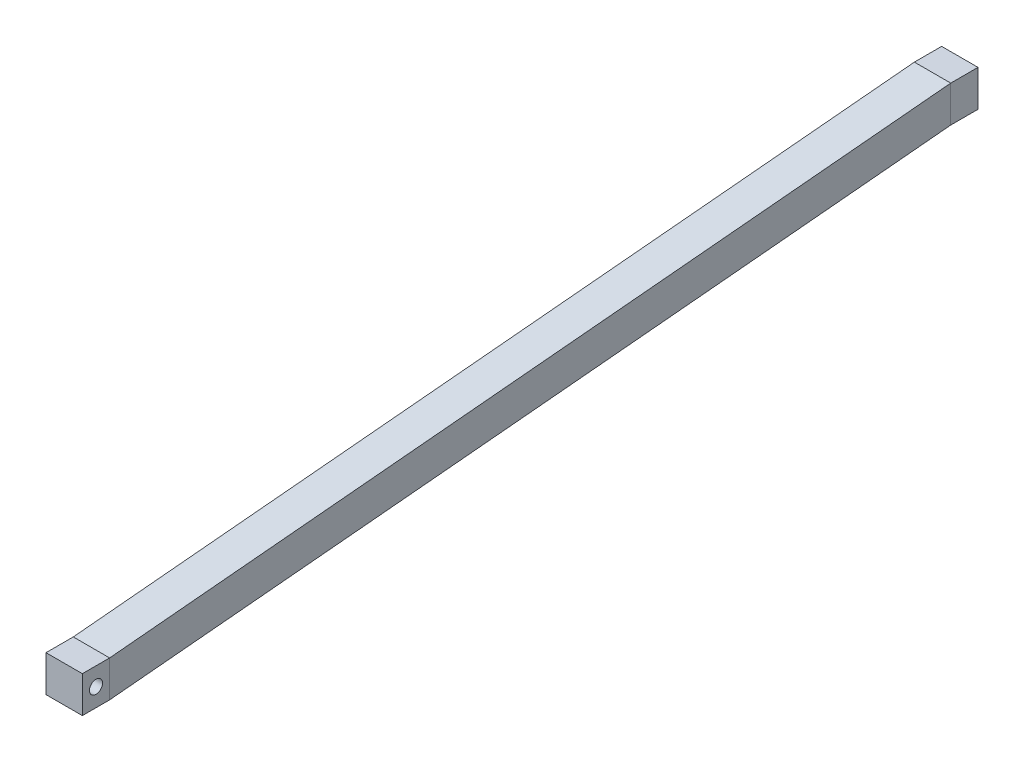
ISO-10303-21;
HEADER;
FILE_DESCRIPTION(('STEP AP214'),'2;1');
FILE_NAME('part.step','',(''),(''),'','','');
FILE_SCHEMA(('AUTOMOTIVE_DESIGN { 1 0 10303 214 1 1 1 1 }'));
ENDSEC;
DATA;
#1=APPLICATION_CONTEXT('core data for automotive mechanical design processes');
#2=APPLICATION_PROTOCOL_DEFINITION('international standard','automotive_design',2000,#1);
#3=PRODUCT_CONTEXT('',#1,'mechanical');
#4=PRODUCT('Part','Part','',(#3));
#5=PRODUCT_RELATED_PRODUCT_CATEGORY('part','',(#4));
#6=PRODUCT_DEFINITION_FORMATION('','',#4);
#7=PRODUCT_DEFINITION_CONTEXT('part definition',#1,'design');
#8=PRODUCT_DEFINITION('design','',#6,#7);
#9=PRODUCT_DEFINITION_SHAPE('','',#8);
#10=(LENGTH_UNIT() NAMED_UNIT(*) SI_UNIT(.MILLI.,.METRE.));
#11=(NAMED_UNIT(*) PLANE_ANGLE_UNIT() SI_UNIT($,.RADIAN.));
#12=(NAMED_UNIT(*) SI_UNIT($,.STERADIAN.) SOLID_ANGLE_UNIT());
#13=UNCERTAINTY_MEASURE_WITH_UNIT(LENGTH_MEASURE(1.E-05),#10,'distance_accuracy_value','');
#14=(GEOMETRIC_REPRESENTATION_CONTEXT(3) GLOBAL_UNCERTAINTY_ASSIGNED_CONTEXT((#13)) GLOBAL_UNIT_ASSIGNED_CONTEXT((#10,
#11,#12)) REPRESENTATION_CONTEXT('',''));
#15=CARTESIAN_POINT('',(0.,0.,0.));
#16=DIRECTION('',(0.,0.,1.));
#17=DIRECTION('',(1.,0.,0.));
#18=AXIS2_PLACEMENT_3D('',#15,#16,#17);
#19=CARTESIAN_POINT('',(0.,-5.66935990611303,-1.96438124069023));
#20=DIRECTION('',(0.,0.944887603707366,0.327394893607323));
#21=DIRECTION('',(0.,-0.327394893607323,0.944887603707367));
#22=AXIS2_PLACEMENT_3D('',#19,#20,#21);
#23=PLANE('',#22);
#24=DIRECTION('',(-0.215198919121659,-0.319724108409322,0.92274910984012));
#25=VECTOR('',#24,1.);
#26=CARTESIAN_POINT('',(6.35,-6.35,0.));
#27=LINE('',#26,#25);
#28=CARTESIAN_POINT('',(6.35,-6.35,0.));
#29=VERTEX_POINT('',#28);
#30=CARTESIAN_POINT('',(-49.2125,-88.9,238.245840754));
#31=VERTEX_POINT('',#30);
#32=EDGE_CURVE('E208',#29,#31,#27,.T.);
#33=ORIENTED_EDGE('',*,*,#32,.T.);
#34=DIRECTION('',(1.,0.,0.));
#35=VECTOR('',#34,1.);
#36=CARTESIAN_POINT('',(-49.2125,-88.9,238.245840754));
#37=LINE('',#36,#35);
#38=CARTESIAN_POINT('',(-61.9125,-88.9,238.245840754));
#39=VERTEX_POINT('',#38);
#40=EDGE_CURVE('E12',#39,#31,#37,.T.);
#41=ORIENTED_EDGE('',*,*,#40,.F.);
#42=DIRECTION('',(-0.215198919121659,-0.319724108409322,0.92274910984012));
#43=VECTOR('',#42,1.);
#44=CARTESIAN_POINT('',(-6.35,-6.35,0.));
#45=LINE('',#44,#43);
#46=CARTESIAN_POINT('',(-6.35,-6.35,0.));
#47=VERTEX_POINT('',#46);
#48=EDGE_CURVE('E70',#47,#39,#45,.T.);
#49=ORIENTED_EDGE('',*,*,#48,.F.);
#50=DIRECTION('',(1.,0.,0.));
#51=VECTOR('',#50,1.);
#52=CARTESIAN_POINT('',(-6.35,-6.35,0.));
#53=LINE('',#52,#51);
#54=EDGE_CURVE('E226',#47,#29,#53,.T.);
#55=ORIENTED_EDGE('',*,*,#54,.T.);
#56=EDGE_LOOP('',(#33,#41,#49,#55));
#57=FACE_BOUND('',#56,.T.);
#58=ADVANCED_FACE('F51',(#57),#23,.F.);
#59=CARTESIAN_POINT('',(-6.02244391925538,0.,-1.4045241637991));
#60=DIRECTION('',(0.973866708146997,0.,0.227120309005894));
#61=DIRECTION('',(0.227120309005894,0.,-0.973866708146997));
#62=AXIS2_PLACEMENT_3D('',#59,#60,#61);
#63=PLANE('',#62);
#64=ORIENTED_EDGE('',*,*,#48,.T.);
#65=DIRECTION('',(0.,-1.,0.));
#66=VECTOR('',#65,1.);
#67=CARTESIAN_POINT('',(-61.9125,-88.9,238.245840754));
#68=LINE('',#67,#66);
#69=CARTESIAN_POINT('',(-61.9125,-76.2,238.245840754));
#70=VERTEX_POINT('',#69);
#71=EDGE_CURVE('E56',#70,#39,#68,.T.);
#72=ORIENTED_EDGE('',*,*,#71,.F.);
#73=DIRECTION('',(-0.215198919121659,-0.319724108409322,0.92274910984012));
#74=VECTOR('',#73,1.);
#75=CARTESIAN_POINT('',(-6.35,6.35,0.));
#76=LINE('',#75,#74);
#77=CARTESIAN_POINT('',(-6.35,6.35,0.));
#78=VERTEX_POINT('',#77);
#79=EDGE_CURVE('E301',#78,#70,#76,.T.);
#80=ORIENTED_EDGE('',*,*,#79,.F.);
#81=DIRECTION('',(0.,-1.,0.));
#82=VECTOR('',#81,1.);
#83=CARTESIAN_POINT('',(-6.35,6.35,0.));
#84=LINE('',#83,#82);
#85=EDGE_CURVE('E209',#78,#47,#84,.T.);
#86=ORIENTED_EDGE('',*,*,#85,.T.);
#87=EDGE_LOOP('',(#64,#72,#80,#86));
#88=FACE_BOUND('',#87,.T.);
#89=ADVANCED_FACE('F302',(#88),#63,.F.);
#90=CARTESIAN_POINT('',(6.02244391925536,0.,1.4045241637991));
#91=DIRECTION('',(-0.973866708146996,0.,-0.227120309005894));
#92=DIRECTION('',(-0.227120309005894,0.,0.973866708146997));
#93=AXIS2_PLACEMENT_3D('',#90,#91,#92);
#94=PLANE('',#93);
#95=DIRECTION('',(-0.215198919121659,-0.319724108409322,0.92274910984012));
#96=VECTOR('',#95,1.);
#97=CARTESIAN_POINT('',(6.35,6.35,0.));
#98=LINE('',#97,#96);
#99=CARTESIAN_POINT('',(6.35,6.35,0.));
#100=VERTEX_POINT('',#99);
#101=CARTESIAN_POINT('',(-49.2125,-76.2,238.245840754));
#102=VERTEX_POINT('',#101);
#103=EDGE_CURVE('E304',#100,#102,#98,.T.);
#104=ORIENTED_EDGE('',*,*,#103,.T.);
#105=DIRECTION('',(0.,1.,0.));
#106=VECTOR('',#105,1.);
#107=CARTESIAN_POINT('',(-49.2125,-88.9,238.245840754));
#108=LINE('',#107,#106);
#109=EDGE_CURVE('E62',#31,#102,#108,.T.);
#110=ORIENTED_EDGE('',*,*,#109,.F.);
#111=ORIENTED_EDGE('',*,*,#32,.F.);
#112=DIRECTION('',(0.,1.,0.));
#113=VECTOR('',#112,1.);
#114=CARTESIAN_POINT('',(6.35,6.35,0.));
#115=LINE('',#114,#113);
#116=EDGE_CURVE('E287',#29,#100,#115,.T.);
#117=ORIENTED_EDGE('',*,*,#116,.T.);
#118=EDGE_LOOP('',(#104,#110,#111,#117));
#119=FACE_BOUND('',#118,.T.);
#120=ADVANCED_FACE('F337',(#119),#94,.F.);
#121=CARTESIAN_POINT('',(0.,5.66935990611307,1.96438124069025));
#122=DIRECTION('',(0.,-0.944887603707367,-0.327394893607323));
#123=DIRECTION('',(0.,0.327394893607323,-0.944887603707367));
#124=AXIS2_PLACEMENT_3D('',#121,#122,#123);
#125=PLANE('',#124);
#126=ORIENTED_EDGE('',*,*,#79,.T.);
#127=DIRECTION('',(-1.,0.,0.));
#128=VECTOR('',#127,1.);
#129=CARTESIAN_POINT('',(-49.2125,-76.2,238.245840754));
#130=LINE('',#129,#128);
#131=EDGE_CURVE('E238',#102,#70,#130,.T.);
#132=ORIENTED_EDGE('',*,*,#131,.F.);
#133=ORIENTED_EDGE('',*,*,#103,.F.);
#134=DIRECTION('',(-1.,0.,0.));
#135=VECTOR('',#134,1.);
#136=CARTESIAN_POINT('',(-6.35,6.35,0.));
#137=LINE('',#136,#135);
#138=EDGE_CURVE('E204',#100,#78,#137,.T.);
#139=ORIENTED_EDGE('',*,*,#138,.T.);
#140=EDGE_LOOP('',(#126,#132,#133,#139));
#141=FACE_BOUND('',#140,.T.);
#142=ADVANCED_FACE('F53',(#141),#125,.F.);
#143=CARTESIAN_POINT('',(6.35,6.35,-9.525));
#144=DIRECTION('',(-1.,0.,0.));
#145=DIRECTION('',(0.,0.,1.));
#146=AXIS2_PLACEMENT_3D('',#143,#144,#145);
#147=PLANE('',#146);
#148=ORIENTED_EDGE('',*,*,#116,.F.);
#149=DIRECTION('',(0.,0.,1.));
#150=VECTOR('',#149,1.);
#151=CARTESIAN_POINT('',(6.35,-6.35,-9.525));
#152=LINE('',#151,#150);
#153=CARTESIAN_POINT('',(6.35,-6.35,-9.525));
#154=VERTEX_POINT('',#153);
#155=EDGE_CURVE('E282',#154,#29,#152,.T.);
#156=ORIENTED_EDGE('',*,*,#155,.F.);
#157=DIRECTION('',(0.,-1.,0.));
#158=VECTOR('',#157,1.);
#159=CARTESIAN_POINT('',(6.35,6.35,-9.525));
#160=LINE('',#159,#158);
#161=CARTESIAN_POINT('',(6.35,6.35,-9.525));
#162=VERTEX_POINT('',#161);
#163=EDGE_CURVE('E148',#162,#154,#160,.T.);
#164=ORIENTED_EDGE('',*,*,#163,.F.);
#165=DIRECTION('',(0.,0.,1.));
#166=VECTOR('',#165,1.);
#167=CARTESIAN_POINT('',(6.35,6.35,-9.525));
#168=LINE('',#167,#166);
#169=EDGE_CURVE('E192',#162,#100,#168,.T.);
#170=ORIENTED_EDGE('',*,*,#169,.T.);
#171=EDGE_LOOP('',(#148,#156,#164,#170));
#172=FACE_BOUND('',#171,.T.);
#173=ADVANCED_FACE('F379',(#172),#147,.F.);
#174=CARTESIAN_POINT('',(6.35,-6.35,-9.525));
#175=DIRECTION('',(0.,1.,0.));
#176=DIRECTION('',(0.,0.,1.));
#177=AXIS2_PLACEMENT_3D('',#174,#175,#176);
#178=PLANE('',#177);
#179=ORIENTED_EDGE('',*,*,#54,.F.);
#180=DIRECTION('',(0.,0.,1.));
#181=VECTOR('',#180,1.);
#182=CARTESIAN_POINT('',(-6.35,-6.35,-9.525));
#183=LINE('',#182,#181);
#184=CARTESIAN_POINT('',(-6.35,-6.35,-9.525));
#185=VERTEX_POINT('',#184);
#186=EDGE_CURVE('E276',#185,#47,#183,.T.);
#187=ORIENTED_EDGE('',*,*,#186,.F.);
#188=DIRECTION('',(-1.,0.,0.));
#189=VECTOR('',#188,1.);
#190=CARTESIAN_POINT('',(6.35,-6.35,-9.525));
#191=LINE('',#190,#189);
#192=EDGE_CURVE('E151',#154,#185,#191,.T.);
#193=ORIENTED_EDGE('',*,*,#192,.F.);
#194=ORIENTED_EDGE('',*,*,#155,.T.);
#195=EDGE_LOOP('',(#179,#187,#193,#194));
#196=FACE_BOUND('',#195,.T.);
#197=ADVANCED_FACE('F381',(#196),#178,.F.);
#198=CARTESIAN_POINT('',(-6.35,6.35,-9.525));
#199=DIRECTION('',(1.,0.,0.));
#200=DIRECTION('',(0.,0.,-1.));
#201=AXIS2_PLACEMENT_3D('',#198,#199,#200);
#202=PLANE('',#201);
#203=ORIENTED_EDGE('',*,*,#85,.F.);
#204=DIRECTION('',(0.,0.,1.));
#205=VECTOR('',#204,1.);
#206=CARTESIAN_POINT('',(-6.35,6.35,-9.525));
#207=LINE('',#206,#205);
#208=CARTESIAN_POINT('',(-6.35,6.35,-9.525));
#209=VERTEX_POINT('',#208);
#210=EDGE_CURVE('E200',#209,#78,#207,.T.);
#211=ORIENTED_EDGE('',*,*,#210,.F.);
#212=DIRECTION('',(0.,1.,0.));
#213=VECTOR('',#212,1.);
#214=CARTESIAN_POINT('',(-6.35,6.35,-9.525));
#215=LINE('',#214,#213);
#216=EDGE_CURVE('E374',#185,#209,#215,.T.);
#217=ORIENTED_EDGE('',*,*,#216,.F.);
#218=ORIENTED_EDGE('',*,*,#186,.T.);
#219=EDGE_LOOP('',(#203,#211,#217,#218));
#220=FACE_BOUND('',#219,.T.);
#221=ADVANCED_FACE('F182',(#220),#202,.F.);
#222=CARTESIAN_POINT('',(6.35,6.35,-9.525));
#223=DIRECTION('',(0.,-1.,0.));
#224=DIRECTION('',(0.,0.,-1.));
#225=AXIS2_PLACEMENT_3D('',#222,#223,#224);
#226=PLANE('',#225);
#227=ORIENTED_EDGE('',*,*,#138,.F.);
#228=ORIENTED_EDGE('',*,*,#169,.F.);
#229=DIRECTION('',(1.,0.,0.));
#230=VECTOR('',#229,1.);
#231=CARTESIAN_POINT('',(6.35,6.35,-9.525));
#232=LINE('',#231,#230);
#233=EDGE_CURVE('E201',#209,#162,#232,.T.);
#234=ORIENTED_EDGE('',*,*,#233,.F.);
#235=ORIENTED_EDGE('',*,*,#210,.T.);
#236=EDGE_LOOP('',(#227,#228,#234,#235));
#237=FACE_BOUND('',#236,.T.);
#238=ADVANCED_FACE('F177',(#237),#226,.F.);
#239=CARTESIAN_POINT('',(0.,0.,-9.525));
#240=DIRECTION('',(0.,0.,-1.));
#241=DIRECTION('',(-1.,0.,0.));
#242=AXIS2_PLACEMENT_3D('',#239,#240,#241);
#243=PLANE('',#242);
#244=CARTESIAN_POINT('',(0.,0.,-9.525));
#245=DIRECTION('',(0.,0.,-1.));
#246=DIRECTION('',(-1.,0.,0.));
#247=AXIS2_PLACEMENT_3D('',#244,#245,#246);
#248=CIRCLE('',#247,1.905);
#249=CARTESIAN_POINT('',(-1.905,0.,-9.525));
#250=VERTEX_POINT('',#249);
#251=EDGE_CURVE('E548',#250,#250,#248,.T.);
#252=ORIENTED_EDGE('',*,*,#251,.F.);
#253=EDGE_LOOP('',(#252));
#254=FACE_BOUND('',#253,.T.);
#255=ORIENTED_EDGE('',*,*,#163,.T.);
#256=ORIENTED_EDGE('',*,*,#192,.T.);
#257=ORIENTED_EDGE('',*,*,#216,.T.);
#258=ORIENTED_EDGE('',*,*,#233,.T.);
#259=EDGE_LOOP('',(#255,#256,#257,#258));
#260=FACE_BOUND('',#259,.T.);
#261=ADVANCED_FACE('F171',(#254,#260),#243,.T.);
#262=CARTESIAN_POINT('',(-61.9125,-76.2,247.770840754));
#263=DIRECTION('',(1.,0.,0.));
#264=DIRECTION('',(0.,0.,-1.));
#265=AXIS2_PLACEMENT_3D('',#262,#263,#264);
#266=PLANE('',#265);
#267=CARTESIAN_POINT('',(-61.9125,-82.55,243.008340754));
#268=DIRECTION('',(1.,0.,0.));
#269=DIRECTION('',(0.,0.,-1.));
#270=AXIS2_PLACEMENT_3D('',#267,#268,#269);
#271=CIRCLE('',#270,2.28600000000004);
#272=CARTESIAN_POINT('',(-61.9125,-82.55,240.722340754));
#273=VERTEX_POINT('',#272);
#274=EDGE_CURVE('E144',#273,#273,#271,.T.);
#275=ORIENTED_EDGE('',*,*,#274,.T.);
#276=EDGE_LOOP('',(#275));
#277=FACE_BOUND('',#276,.T.);
#278=ORIENTED_EDGE('',*,*,#71,.T.);
#279=DIRECTION('',(0.,0.,-1.));
#280=VECTOR('',#279,1.);
#281=CARTESIAN_POINT('',(-61.9125,-88.9,247.770840754));
#282=LINE('',#281,#280);
#283=CARTESIAN_POINT('',(-61.9125,-88.9,247.770840754));
#284=VERTEX_POINT('',#283);
#285=EDGE_CURVE('E128',#284,#39,#282,.T.);
#286=ORIENTED_EDGE('',*,*,#285,.F.);
#287=DIRECTION('',(0.,-1.,0.));
#288=VECTOR('',#287,1.);
#289=CARTESIAN_POINT('',(-61.9125,-76.2,247.770840754));
#290=LINE('',#289,#288);
#291=CARTESIAN_POINT('',(-61.9125,-76.2,247.770840754));
#292=VERTEX_POINT('',#291);
#293=EDGE_CURVE('E135',#292,#284,#290,.T.);
#294=ORIENTED_EDGE('',*,*,#293,.F.);
#295=DIRECTION('',(0.,0.,-1.));
#296=VECTOR('',#295,1.);
#297=CARTESIAN_POINT('',(-61.9125,-76.2,247.770840754));
#298=LINE('',#297,#296);
#299=EDGE_CURVE('E230',#292,#70,#298,.T.);
#300=ORIENTED_EDGE('',*,*,#299,.T.);
#301=EDGE_LOOP('',(#278,#286,#294,#300));
#302=FACE_BOUND('',#301,.T.);
#303=ADVANCED_FACE('F146',(#277,#302),#266,.F.);
#304=CARTESIAN_POINT('',(-61.9125,-88.9,247.770840754));
#305=DIRECTION('',(0.,1.,0.));
#306=DIRECTION('',(0.,0.,1.));
#307=AXIS2_PLACEMENT_3D('',#304,#305,#306);
#308=PLANE('',#307);
#309=ORIENTED_EDGE('',*,*,#40,.T.);
#310=DIRECTION('',(0.,0.,-1.));
#311=VECTOR('',#310,1.);
#312=CARTESIAN_POINT('',(-49.2125,-88.9,247.770840754));
#313=LINE('',#312,#311);
#314=CARTESIAN_POINT('',(-49.2125,-88.9,247.770840754));
#315=VERTEX_POINT('',#314);
#316=EDGE_CURVE('E131',#315,#31,#313,.T.);
#317=ORIENTED_EDGE('',*,*,#316,.F.);
#318=DIRECTION('',(1.,0.,0.));
#319=VECTOR('',#318,1.);
#320=CARTESIAN_POINT('',(-61.9125,-88.9,247.770840754));
#321=LINE('',#320,#319);
#322=EDGE_CURVE('E124',#284,#315,#321,.T.);
#323=ORIENTED_EDGE('',*,*,#322,.F.);
#324=ORIENTED_EDGE('',*,*,#285,.T.);
#325=EDGE_LOOP('',(#309,#317,#323,#324));
#326=FACE_BOUND('',#325,.T.);
#327=ADVANCED_FACE('F126',(#326),#308,.F.);
#328=CARTESIAN_POINT('',(-49.2125,-76.2,247.770840754));
#329=DIRECTION('',(-1.,0.,0.));
#330=DIRECTION('',(0.,-1.,0.));
#331=AXIS2_PLACEMENT_3D('',#328,#329,#330);
#332=PLANE('',#331);
#333=CARTESIAN_POINT('',(-49.2125,-82.55,243.008340754));
#334=DIRECTION('',(1.,0.,0.));
#335=DIRECTION('',(0.,1.,0.));
#336=AXIS2_PLACEMENT_3D('',#333,#334,#335);
#337=CIRCLE('',#336,2.28600000000004);
#338=CARTESIAN_POINT('',(-49.2125,-80.264,243.008340754));
#339=VERTEX_POINT('',#338);
#340=EDGE_CURVE('E547',#339,#339,#337,.T.);
#341=ORIENTED_EDGE('',*,*,#340,.F.);
#342=EDGE_LOOP('',(#341));
#343=FACE_BOUND('',#342,.T.);
#344=ORIENTED_EDGE('',*,*,#109,.T.);
#345=DIRECTION('',(0.,0.,-1.));
#346=VECTOR('',#345,1.);
#347=CARTESIAN_POINT('',(-49.2125,-76.2,247.770840754));
#348=LINE('',#347,#346);
#349=CARTESIAN_POINT('',(-49.2125,-76.2,247.770840754));
#350=VERTEX_POINT('',#349);
#351=EDGE_CURVE('E153',#350,#102,#348,.T.);
#352=ORIENTED_EDGE('',*,*,#351,.F.);
#353=DIRECTION('',(0.,1.,0.));
#354=VECTOR('',#353,1.);
#355=CARTESIAN_POINT('',(-49.2125,-76.2,247.770840754));
#356=LINE('',#355,#354);
#357=EDGE_CURVE('E134',#315,#350,#356,.T.);
#358=ORIENTED_EDGE('',*,*,#357,.F.);
#359=ORIENTED_EDGE('',*,*,#316,.T.);
#360=EDGE_LOOP('',(#344,#352,#358,#359));
#361=FACE_BOUND('',#360,.T.);
#362=ADVANCED_FACE('F254',(#343,#361),#332,.F.);
#363=CARTESIAN_POINT('',(-61.9125,-76.2,247.770840754));
#364=DIRECTION('',(0.,-1.,0.));
#365=DIRECTION('',(0.,0.,-1.));
#366=AXIS2_PLACEMENT_3D('',#363,#364,#365);
#367=PLANE('',#366);
#368=ORIENTED_EDGE('',*,*,#131,.T.);
#369=ORIENTED_EDGE('',*,*,#299,.F.);
#370=DIRECTION('',(-1.,0.,0.));
#371=VECTOR('',#370,1.);
#372=CARTESIAN_POINT('',(-61.9125,-76.2,247.770840754));
#373=LINE('',#372,#371);
#374=EDGE_CURVE('E140',#350,#292,#373,.T.);
#375=ORIENTED_EDGE('',*,*,#374,.F.);
#376=ORIENTED_EDGE('',*,*,#351,.T.);
#377=EDGE_LOOP('',(#368,#369,#375,#376));
#378=FACE_BOUND('',#377,.T.);
#379=ADVANCED_FACE('F245',(#378),#367,.F.);
#380=CARTESIAN_POINT('',(0.,0.,247.770840754));
#381=DIRECTION('',(0.,0.,1.));
#382=DIRECTION('',(1.,0.,0.));
#383=AXIS2_PLACEMENT_3D('',#380,#381,#382);
#384=PLANE('',#383);
#385=ORIENTED_EDGE('',*,*,#293,.T.);
#386=ORIENTED_EDGE('',*,*,#322,.T.);
#387=ORIENTED_EDGE('',*,*,#357,.T.);
#388=ORIENTED_EDGE('',*,*,#374,.T.);
#389=EDGE_LOOP('',(#385,#386,#387,#388));
#390=FACE_BOUND('',#389,.T.);
#391=ADVANCED_FACE('F138',(#390),#384,.T.);
#392=CARTESIAN_POINT('',(-61.9126,-82.55,243.008340754));
#393=DIRECTION('',(1.,0.,0.));
#394=DIRECTION('',(0.,1.,0.));
#395=AXIS2_PLACEMENT_3D('',#392,#393,#394);
#396=CYLINDRICAL_SURFACE('',#395,2.28600000000004);
#397=ORIENTED_EDGE('',*,*,#340,.T.);
#398=EDGE_LOOP('',(#397));
#399=FACE_BOUND('',#398,.T.);
#400=ORIENTED_EDGE('',*,*,#274,.F.);
#401=EDGE_LOOP('',(#400));
#402=FACE_BOUND('',#401,.T.);
#403=ADVANCED_FACE('F470',(#399,#402),#396,.F.);
#404=CARTESIAN_POINT('',(0.,0.,3.175));
#405=DIRECTION('',(0.,0.,-1.));
#406=DIRECTION('',(-1.,0.,0.));
#407=AXIS2_PLACEMENT_3D('',#404,#405,#406);
#408=CYLINDRICAL_SURFACE('',#407,1.905);
#409=CARTESIAN_POINT('',(0.,0.,3.175));
#410=DIRECTION('',(0.,0.,-1.));
#411=DIRECTION('',(-1.,0.,0.));
#412=AXIS2_PLACEMENT_3D('',#409,#410,#411);
#413=CIRCLE('',#412,1.905);
#414=CARTESIAN_POINT('',(-1.905,0.,3.175));
#415=VERTEX_POINT('',#414);
#416=EDGE_CURVE('E546',#415,#415,#413,.T.);
#417=ORIENTED_EDGE('',*,*,#416,.F.);
#418=EDGE_LOOP('',(#417));
#419=FACE_BOUND('',#418,.T.);
#420=ORIENTED_EDGE('',*,*,#251,.T.);
#421=EDGE_LOOP('',(#420));
#422=FACE_BOUND('',#421,.T.);
#423=ADVANCED_FACE('F486',(#419,#422),#408,.F.);
#424=CARTESIAN_POINT('',(0.,0.,3.175));
#425=DIRECTION('',(0.,0.,-1.));
#426=DIRECTION('',(-1.,0.,0.));
#427=AXIS2_PLACEMENT_3D('',#424,#425,#426);
#428=PLANE('',#427);
#429=ORIENTED_EDGE('',*,*,#416,.T.);
#430=EDGE_LOOP('',(#429));
#431=FACE_BOUND('',#430,.T.);
#432=ADVANCED_FACE('F499',(#431),#428,.T.);
#433=CLOSED_SHELL('',(#58,#89,#120,#142,#173,#197,#221,#238,#261,#303,#327,#362,#379,#391,#403,
#423,#432));
#434=MANIFOLD_SOLID_BREP('B2',#433);
#435=ADVANCED_BREP_SHAPE_REPRESENTATION('',(#18,#434),#14);
#436=SHAPE_DEFINITION_REPRESENTATION(#9,#435);
ENDSEC;
END-ISO-10303-21;
